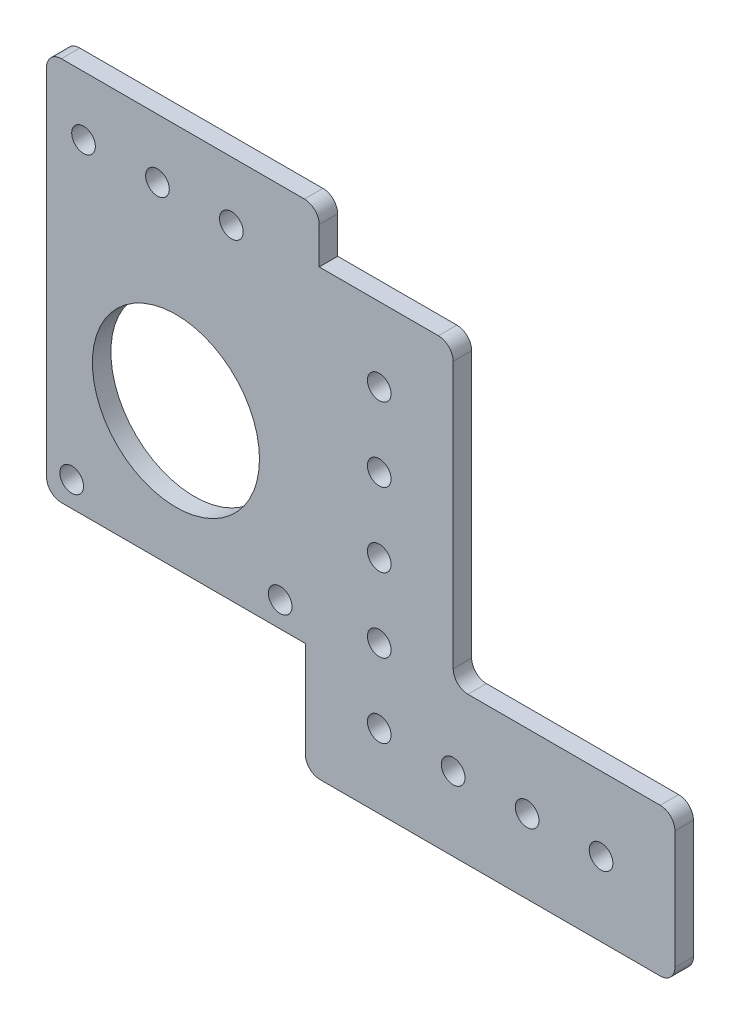
ISO-10303-21;
HEADER;
FILE_DESCRIPTION(('STEP AP214'),'2;1');
FILE_NAME('part.step','',(''),(''),'','','');
FILE_SCHEMA(('AUTOMOTIVE_DESIGN { 1 0 10303 214 1 1 1 1 }'));
ENDSEC;
DATA;
#1=APPLICATION_CONTEXT('core data for automotive mechanical design processes');
#2=APPLICATION_PROTOCOL_DEFINITION('international standard','automotive_design',2000,#1);
#3=PRODUCT_CONTEXT('',#1,'mechanical');
#4=PRODUCT('Part','Part','',(#3));
#5=PRODUCT_RELATED_PRODUCT_CATEGORY('part','',(#4));
#6=PRODUCT_DEFINITION_FORMATION('','',#4);
#7=PRODUCT_DEFINITION_CONTEXT('part definition',#1,'design');
#8=PRODUCT_DEFINITION('design','',#6,#7);
#9=PRODUCT_DEFINITION_SHAPE('','',#8);
#10=(LENGTH_UNIT() NAMED_UNIT(*) SI_UNIT(.MILLI.,.METRE.));
#11=(NAMED_UNIT(*) PLANE_ANGLE_UNIT() SI_UNIT($,.RADIAN.));
#12=(NAMED_UNIT(*) SI_UNIT($,.STERADIAN.) SOLID_ANGLE_UNIT());
#13=UNCERTAINTY_MEASURE_WITH_UNIT(LENGTH_MEASURE(1.E-05),#10,'distance_accuracy_value','');
#14=(GEOMETRIC_REPRESENTATION_CONTEXT(3) GLOBAL_UNCERTAINTY_ASSIGNED_CONTEXT((#13)) GLOBAL_UNIT_ASSIGNED_CONTEXT((#10,
#11,#12)) REPRESENTATION_CONTEXT('',''));
#15=CARTESIAN_POINT('',(0.,0.,0.));
#16=DIRECTION('',(0.,0.,1.));
#17=DIRECTION('',(1.,0.,0.));
#18=AXIS2_PLACEMENT_3D('',#15,#16,#17);
#19=CARTESIAN_POINT('',(12.7,0.,3.175));
#20=DIRECTION('',(-1.,0.,0.));
#21=DIRECTION('',(0.,-1.,0.));
#22=AXIS2_PLACEMENT_3D('',#19,#20,#21);
#23=PLANE('',#22);
#24=DIRECTION('',(0.,1.,0.));
#25=VECTOR('',#24,1.);
#26=CARTESIAN_POINT('',(12.7,0.,0.));
#27=LINE('',#26,#25);
#28=CARTESIAN_POINT('',(12.7,-10.16,0.));
#29=VERTEX_POINT('',#28);
#30=CARTESIAN_POINT('',(12.7,35.56,0.));
#31=VERTEX_POINT('',#30);
#32=EDGE_CURVE('E211',#29,#31,#27,.T.);
#33=ORIENTED_EDGE('',*,*,#32,.T.);
#34=DIRECTION('',(0.,0.,-1.));
#35=VECTOR('',#34,1.);
#36=CARTESIAN_POINT('',(12.7,35.56,3.175));
#37=LINE('',#36,#35);
#38=CARTESIAN_POINT('',(12.7,35.56,3.175));
#39=VERTEX_POINT('',#38);
#40=EDGE_CURVE('E262',#31,#39,#37,.F.);
#41=ORIENTED_EDGE('',*,*,#40,.T.);
#42=DIRECTION('',(0.,1.,0.));
#43=VECTOR('',#42,1.);
#44=CARTESIAN_POINT('',(12.7,0.,3.175));
#45=LINE('',#44,#43);
#46=CARTESIAN_POINT('',(12.7,-10.16,3.175));
#47=VERTEX_POINT('',#46);
#48=EDGE_CURVE('E184',#47,#39,#45,.T.);
#49=ORIENTED_EDGE('',*,*,#48,.F.);
#50=DIRECTION('',(0.,0.,1.));
#51=VECTOR('',#50,1.);
#52=CARTESIAN_POINT('',(12.7,-10.16,0.));
#53=LINE('',#52,#51);
#54=EDGE_CURVE('E260',#47,#29,#53,.F.);
#55=ORIENTED_EDGE('',*,*,#54,.T.);
#56=EDGE_LOOP('',(#33,#41,#49,#55));
#57=FACE_BOUND('',#56,.T.);
#58=ADVANCED_FACE('F34',(#57),#23,.F.);
#59=CARTESIAN_POINT('',(-57.15,0.,3.175));
#60=DIRECTION('',(-1.,0.,0.));
#61=DIRECTION('',(0.,0.,1.));
#62=AXIS2_PLACEMENT_3D('',#59,#60,#61);
#63=PLANE('',#62);
#64=DIRECTION('',(0.,1.,0.));
#65=VECTOR('',#64,1.);
#66=CARTESIAN_POINT('',(-57.15,0.,3.175));
#67=LINE('',#66,#65);
#68=CARTESIAN_POINT('',(-57.15,-16.568999882,3.175));
#69=VERTEX_POINT('',#68);
#70=CARTESIAN_POINT('',(-57.15,44.391000118,3.175));
#71=VERTEX_POINT('',#70);
#72=EDGE_CURVE('E224',#69,#71,#67,.T.);
#73=ORIENTED_EDGE('',*,*,#72,.T.);
#74=DIRECTION('',(0.,0.,-1.));
#75=VECTOR('',#74,1.);
#76=CARTESIAN_POINT('',(-57.15,44.391000118,3.175));
#77=LINE('',#76,#75);
#78=CARTESIAN_POINT('',(-57.15,44.391000118,0.));
#79=VERTEX_POINT('',#78);
#80=EDGE_CURVE('E11',#71,#79,#77,.T.);
#81=ORIENTED_EDGE('',*,*,#80,.T.);
#82=DIRECTION('',(0.,1.,0.));
#83=VECTOR('',#82,1.);
#84=CARTESIAN_POINT('',(-57.15,0.,0.));
#85=LINE('',#84,#83);
#86=CARTESIAN_POINT('',(-57.15,-16.568999882,0.));
#87=VERTEX_POINT('',#86);
#88=EDGE_CURVE('E199',#87,#79,#85,.T.);
#89=ORIENTED_EDGE('',*,*,#88,.F.);
#90=DIRECTION('',(0.,0.,-1.));
#91=VECTOR('',#90,1.);
#92=CARTESIAN_POINT('',(-57.15,-16.568999882,3.175));
#93=LINE('',#92,#91);
#94=EDGE_CURVE('E256',#87,#69,#93,.F.);
#95=ORIENTED_EDGE('',*,*,#94,.T.);
#96=EDGE_LOOP('',(#73,#81,#89,#95));
#97=FACE_BOUND('',#96,.T.);
#98=ADVANCED_FACE('F423',(#97),#63,.T.);
#99=CARTESIAN_POINT('',(0.,-19.108999882,3.175));
#100=DIRECTION('',(0.,1.,0.));
#101=DIRECTION('',(0.,0.,1.));
#102=AXIS2_PLACEMENT_3D('',#99,#100,#101);
#103=PLANE('',#102);
#104=DIRECTION('',(1.,0.,0.));
#105=VECTOR('',#104,1.);
#106=CARTESIAN_POINT('',(0.,-19.108999882,3.175));
#107=LINE('',#106,#105);
#108=CARTESIAN_POINT('',(-54.61,-19.108999882,3.175));
#109=VERTEX_POINT('',#108);
#110=CARTESIAN_POINT('',(-12.7,-19.108999882,3.175));
#111=VERTEX_POINT('',#110);
#112=EDGE_CURVE('E370',#109,#111,#107,.T.);
#113=ORIENTED_EDGE('',*,*,#112,.F.);
#114=DIRECTION('',(0.,0.,-1.));
#115=VECTOR('',#114,1.);
#116=CARTESIAN_POINT('',(-54.61,-19.108999882,0.));
#117=LINE('',#116,#115);
#118=CARTESIAN_POINT('',(-54.61,-19.108999882,0.));
#119=VERTEX_POINT('',#118);
#120=EDGE_CURVE('E253',#109,#119,#117,.T.);
#121=ORIENTED_EDGE('',*,*,#120,.T.);
#122=DIRECTION('',(1.,0.,0.));
#123=VECTOR('',#122,1.);
#124=CARTESIAN_POINT('',(0.,-19.108999882,0.));
#125=LINE('',#124,#123);
#126=CARTESIAN_POINT('',(-12.7,-19.108999882,0.));
#127=VERTEX_POINT('',#126);
#128=EDGE_CURVE('E202',#119,#127,#125,.T.);
#129=ORIENTED_EDGE('',*,*,#128,.T.);
#130=DIRECTION('',(0.,0.,-1.));
#131=VECTOR('',#130,1.);
#132=CARTESIAN_POINT('',(-12.7,-19.108999882,3.175));
#133=LINE('',#132,#131);
#134=EDGE_CURVE('E198',#111,#127,#133,.T.);
#135=ORIENTED_EDGE('',*,*,#134,.F.);
#136=EDGE_LOOP('',(#113,#121,#129,#135));
#137=FACE_BOUND('',#136,.T.);
#138=ADVANCED_FACE('F428',(#137),#103,.F.);
#139=CARTESIAN_POINT('',(-12.7,0.,3.175));
#140=DIRECTION('',(-1.,0.,0.));
#141=DIRECTION('',(0.,-1.,0.));
#142=AXIS2_PLACEMENT_3D('',#139,#140,#141);
#143=PLANE('',#142);
#144=DIRECTION('',(0.,1.,0.));
#145=VECTOR('',#144,1.);
#146=CARTESIAN_POINT('',(-12.7,0.,0.));
#147=LINE('',#146,#145);
#148=CARTESIAN_POINT('',(-12.7,-35.56,0.));
#149=VERTEX_POINT('',#148);
#150=EDGE_CURVE('E205',#149,#127,#147,.T.);
#151=ORIENTED_EDGE('',*,*,#150,.F.);
#152=DIRECTION('',(0.,0.,-1.));
#153=VECTOR('',#152,1.);
#154=CARTESIAN_POINT('',(-12.7,-35.56,3.175));
#155=LINE('',#154,#153);
#156=CARTESIAN_POINT('',(-12.7,-35.56,3.175));
#157=VERTEX_POINT('',#156);
#158=EDGE_CURVE('E242',#149,#157,#155,.F.);
#159=ORIENTED_EDGE('',*,*,#158,.T.);
#160=DIRECTION('',(0.,1.,0.));
#161=VECTOR('',#160,1.);
#162=CARTESIAN_POINT('',(-12.7,0.,3.175));
#163=LINE('',#162,#161);
#164=EDGE_CURVE('E372',#157,#111,#163,.T.);
#165=ORIENTED_EDGE('',*,*,#164,.T.);
#166=ORIENTED_EDGE('',*,*,#134,.T.);
#167=EDGE_LOOP('',(#151,#159,#165,#166));
#168=FACE_BOUND('',#167,.T.);
#169=ADVANCED_FACE('F437',(#168),#143,.T.);
#170=CARTESIAN_POINT('',(0.,-38.1,3.175));
#171=DIRECTION('',(0.,1.,0.));
#172=DIRECTION('',(0.,0.,1.));
#173=AXIS2_PLACEMENT_3D('',#170,#171,#172);
#174=PLANE('',#173);
#175=DIRECTION('',(1.,0.,0.));
#176=VECTOR('',#175,1.);
#177=CARTESIAN_POINT('',(0.,-38.1,3.175));
#178=LINE('',#177,#176);
#179=CARTESIAN_POINT('',(-10.16,-38.1,3.175));
#180=VERTEX_POINT('',#179);
#181=CARTESIAN_POINT('',(48.26,-38.1,3.175));
#182=VERTEX_POINT('',#181);
#183=EDGE_CURVE('E189',#180,#182,#178,.T.);
#184=ORIENTED_EDGE('',*,*,#183,.F.);
#185=DIRECTION('',(0.,0.,-1.));
#186=VECTOR('',#185,1.);
#187=CARTESIAN_POINT('',(-10.16,-38.1,0.));
#188=LINE('',#187,#186);
#189=CARTESIAN_POINT('',(-10.16,-38.1,0.));
#190=VERTEX_POINT('',#189);
#191=EDGE_CURVE('E229',#180,#190,#188,.T.);
#192=ORIENTED_EDGE('',*,*,#191,.T.);
#193=DIRECTION('',(1.,0.,0.));
#194=VECTOR('',#193,1.);
#195=CARTESIAN_POINT('',(0.,-38.1,0.));
#196=LINE('',#195,#194);
#197=CARTESIAN_POINT('',(48.26,-38.1,0.));
#198=VERTEX_POINT('',#197);
#199=EDGE_CURVE('E208',#190,#198,#196,.T.);
#200=ORIENTED_EDGE('',*,*,#199,.T.);
#201=DIRECTION('',(0.,0.,-1.));
#202=VECTOR('',#201,1.);
#203=CARTESIAN_POINT('',(48.26,-38.1,3.175));
#204=LINE('',#203,#202);
#205=EDGE_CURVE('E227',#198,#182,#204,.F.);
#206=ORIENTED_EDGE('',*,*,#205,.T.);
#207=EDGE_LOOP('',(#184,#192,#200,#206));
#208=FACE_BOUND('',#207,.T.);
#209=ADVANCED_FACE('F434',(#208),#174,.F.);
#210=CARTESIAN_POINT('',(0.,38.1,3.175));
#211=DIRECTION('',(0.,1.,0.));
#212=DIRECTION('',(0.,0.,1.));
#213=AXIS2_PLACEMENT_3D('',#210,#211,#212);
#214=PLANE('',#213);
#215=DIRECTION('',(0.,0.,-1.));
#216=VECTOR('',#215,1.);
#217=CARTESIAN_POINT('',(-10.3111442919186,38.1,3.175));
#218=LINE('',#217,#216);
#219=CARTESIAN_POINT('',(-10.3111442919186,38.1,3.175));
#220=VERTEX_POINT('',#219);
#221=CARTESIAN_POINT('',(-10.3111442919186,38.1,0.));
#222=VERTEX_POINT('',#221);
#223=EDGE_CURVE('E163',#220,#222,#218,.T.);
#224=ORIENTED_EDGE('',*,*,#223,.F.);
#225=DIRECTION('',(1.,0.,0.));
#226=VECTOR('',#225,1.);
#227=CARTESIAN_POINT('',(0.,38.1,3.175));
#228=LINE('',#227,#226);
#229=CARTESIAN_POINT('',(10.16,38.1,3.175));
#230=VERTEX_POINT('',#229);
#231=EDGE_CURVE('E172',#220,#230,#228,.T.);
#232=ORIENTED_EDGE('',*,*,#231,.T.);
#233=DIRECTION('',(0.,0.,-1.));
#234=VECTOR('',#233,1.);
#235=CARTESIAN_POINT('',(10.16,38.1,0.));
#236=LINE('',#235,#234);
#237=CARTESIAN_POINT('',(10.16,38.1,0.));
#238=VERTEX_POINT('',#237);
#239=EDGE_CURVE('E258',#230,#238,#236,.T.);
#240=ORIENTED_EDGE('',*,*,#239,.T.);
#241=DIRECTION('',(1.,0.,0.));
#242=VECTOR('',#241,1.);
#243=CARTESIAN_POINT('',(0.,38.1,0.));
#244=LINE('',#243,#242);
#245=EDGE_CURVE('E174',#222,#238,#244,.T.);
#246=ORIENTED_EDGE('',*,*,#245,.F.);
#247=EDGE_LOOP('',(#224,#232,#240,#246));
#248=FACE_BOUND('',#247,.T.);
#249=ADVANCED_FACE('F170',(#248),#214,.T.);
#250=CARTESIAN_POINT('',(-17.018,-14.790999882,3.175));
#251=DIRECTION('',(0.,0.,-1.));
#252=DIRECTION('',(-1.,0.,0.));
#253=AXIS2_PLACEMENT_3D('',#250,#251,#252);
#254=CYLINDRICAL_SURFACE('',#253,2.03200000000001);
#255=CARTESIAN_POINT('',(-17.018,-14.790999882,3.175));
#256=DIRECTION('',(0.,0.,1.));
#257=DIRECTION('',(1.,0.,0.));
#258=AXIS2_PLACEMENT_3D('',#255,#256,#257);
#259=CIRCLE('',#258,2.03200000000001);
#260=CARTESIAN_POINT('',(-14.986,-14.790999882,3.175));
#261=VERTEX_POINT('',#260);
#262=EDGE_CURVE('E187',#261,#261,#259,.T.);
#263=ORIENTED_EDGE('',*,*,#262,.T.);
#264=EDGE_LOOP('',(#263));
#265=FACE_BOUND('',#264,.T.);
#266=CARTESIAN_POINT('',(-17.018,-14.790999882,0.));
#267=DIRECTION('',(0.,0.,1.));
#268=DIRECTION('',(1.,0.,0.));
#269=AXIS2_PLACEMENT_3D('',#266,#267,#268);
#270=CIRCLE('',#269,2.03200000000001);
#271=CARTESIAN_POINT('',(-14.986,-14.790999882,0.));
#272=VERTEX_POINT('',#271);
#273=EDGE_CURVE('E218',#272,#272,#270,.T.);
#274=ORIENTED_EDGE('',*,*,#273,.F.);
#275=EDGE_LOOP('',(#274));
#276=FACE_BOUND('',#275,.T.);
#277=ADVANCED_FACE('F655',(#265,#276),#254,.F.);
#278=CARTESIAN_POINT('',(-34.925,4.386000118,3.175));
#279=DIRECTION('',(0.,0.,-1.));
#280=DIRECTION('',(-1.,0.,0.));
#281=AXIS2_PLACEMENT_3D('',#278,#279,#280);
#282=CYLINDRICAL_SURFACE('',#281,14.351);
#283=CARTESIAN_POINT('',(-34.925,4.386000118,3.175));
#284=DIRECTION('',(0.,0.,1.));
#285=DIRECTION('',(1.,0.,0.));
#286=AXIS2_PLACEMENT_3D('',#283,#284,#285);
#287=CIRCLE('',#286,14.351);
#288=CARTESIAN_POINT('',(-20.574,4.386000118,3.175));
#289=VERTEX_POINT('',#288);
#290=EDGE_CURVE('E183',#289,#289,#287,.T.);
#291=ORIENTED_EDGE('',*,*,#290,.T.);
#292=EDGE_LOOP('',(#291));
#293=FACE_BOUND('',#292,.T.);
#294=CARTESIAN_POINT('',(-34.925,4.386000118,0.));
#295=DIRECTION('',(0.,0.,1.));
#296=DIRECTION('',(1.,0.,0.));
#297=AXIS2_PLACEMENT_3D('',#294,#295,#296);
#298=CIRCLE('',#297,14.351);
#299=CARTESIAN_POINT('',(-20.574,4.386000118,0.));
#300=VERTEX_POINT('',#299);
#301=EDGE_CURVE('E215',#300,#300,#298,.T.);
#302=ORIENTED_EDGE('',*,*,#301,.F.);
#303=EDGE_LOOP('',(#302));
#304=FACE_BOUND('',#303,.T.);
#305=ADVANCED_FACE('F661',(#293,#304),#282,.F.);
#306=CARTESIAN_POINT('',(-52.832,-14.790999882,3.175));
#307=DIRECTION('',(0.,0.,-1.));
#308=DIRECTION('',(-1.,0.,0.));
#309=AXIS2_PLACEMENT_3D('',#306,#307,#308);
#310=CYLINDRICAL_SURFACE('',#309,2.03200000000001);
#311=CARTESIAN_POINT('',(-52.832,-14.790999882,3.175));
#312=DIRECTION('',(0.,0.,1.));
#313=DIRECTION('',(1.,0.,0.));
#314=AXIS2_PLACEMENT_3D('',#311,#312,#313);
#315=CIRCLE('',#314,2.03200000000001);
#316=CARTESIAN_POINT('',(-50.8,-14.790999882,3.175));
#317=VERTEX_POINT('',#316);
#318=EDGE_CURVE('E195',#317,#317,#315,.F.);
#319=ORIENTED_EDGE('',*,*,#318,.F.);
#320=EDGE_LOOP('',(#319));
#321=FACE_BOUND('',#320,.T.);
#322=CARTESIAN_POINT('',(-52.832,-14.790999882,0.));
#323=DIRECTION('',(0.,0.,1.));
#324=DIRECTION('',(1.,0.,0.));
#325=AXIS2_PLACEMENT_3D('',#322,#323,#324);
#326=CIRCLE('',#325,2.03200000000001);
#327=CARTESIAN_POINT('',(-50.8,-14.790999882,0.));
#328=VERTEX_POINT('',#327);
#329=EDGE_CURVE('E221',#328,#328,#326,.F.);
#330=ORIENTED_EDGE('',*,*,#329,.T.);
#331=EDGE_LOOP('',(#330));
#332=FACE_BOUND('',#331,.T.);
#333=ADVANCED_FACE('F534',(#321,#332),#310,.F.);
#334=CARTESIAN_POINT('',(0.,0.,3.175));
#335=DIRECTION('',(0.,0.,1.));
#336=DIRECTION('',(1.,0.,0.));
#337=AXIS2_PLACEMENT_3D('',#334,#335,#336);
#338=PLANE('',#337);
#339=CARTESIAN_POINT('',(-25.4,36.771000118,3.175));
#340=DIRECTION('',(0.,0.,-1.));
#341=DIRECTION('',(-1.,0.,0.));
#342=AXIS2_PLACEMENT_3D('',#339,#340,#341);
#343=CIRCLE('',#342,2.032);
#344=CARTESIAN_POINT('',(-27.432,36.771000118,3.175));
#345=VERTEX_POINT('',#344);
#346=EDGE_CURVE('E305',#345,#345,#343,.T.);
#347=ORIENTED_EDGE('',*,*,#346,.T.);
#348=EDGE_LOOP('',(#347));
#349=FACE_BOUND('',#348,.T.);
#350=CARTESIAN_POINT('',(-38.1,36.771000118,3.175));
#351=DIRECTION('',(0.,0.,-1.));
#352=DIRECTION('',(-1.,0.,0.));
#353=AXIS2_PLACEMENT_3D('',#350,#351,#352);
#354=CIRCLE('',#353,2.032);
#355=CARTESIAN_POINT('',(-40.132,36.771000118,3.175));
#356=VERTEX_POINT('',#355);
#357=EDGE_CURVE('E824',#356,#356,#354,.T.);
#358=ORIENTED_EDGE('',*,*,#357,.T.);
#359=EDGE_LOOP('',(#358));
#360=FACE_BOUND('',#359,.T.);
#361=CARTESIAN_POINT('',(-50.8,36.771000118,3.175));
#362=DIRECTION('',(0.,0.,-1.));
#363=DIRECTION('',(-1.,0.,0.));
#364=AXIS2_PLACEMENT_3D('',#361,#362,#363);
#365=CIRCLE('',#364,2.032);
#366=CARTESIAN_POINT('',(-52.832,36.771000118,3.175));
#367=VERTEX_POINT('',#366);
#368=EDGE_CURVE('E820',#367,#367,#365,.T.);
#369=ORIENTED_EDGE('',*,*,#368,.T.);
#370=EDGE_LOOP('',(#369));
#371=FACE_BOUND('',#370,.T.);
#372=DIRECTION('',(0.,-1.,0.));
#373=VECTOR('',#372,1.);
#374=CARTESIAN_POINT('',(-10.3111442919186,46.931000118,3.175));
#375=LINE('',#374,#373);
#376=CARTESIAN_POINT('',(-10.3111442919186,44.391000118,3.175));
#377=VERTEX_POINT('',#376);
#378=EDGE_CURVE('E160',#377,#220,#375,.T.);
#379=ORIENTED_EDGE('',*,*,#378,.F.);
#380=CARTESIAN_POINT('',(-12.8511442919186,44.391000118,3.175));
#381=DIRECTION('',(0.,0.,1.));
#382=DIRECTION('',(1.,0.,0.));
#383=AXIS2_PLACEMENT_3D('',#380,#381,#382);
#384=CIRCLE('',#383,2.54);
#385=CARTESIAN_POINT('',(-12.8511442919186,46.931000118,3.175));
#386=VERTEX_POINT('',#385);
#387=EDGE_CURVE('E42',#377,#386,#384,.T.);
#388=ORIENTED_EDGE('',*,*,#387,.T.);
#389=DIRECTION('',(1.,0.,0.));
#390=VECTOR('',#389,1.);
#391=CARTESIAN_POINT('',(-10.3111442919186,46.931000118,3.175));
#392=LINE('',#391,#390);
#393=CARTESIAN_POINT('',(-54.61,46.931000118,3.175));
#394=VERTEX_POINT('',#393);
#395=EDGE_CURVE('E167',#394,#386,#392,.T.);
#396=ORIENTED_EDGE('',*,*,#395,.F.);
#397=CARTESIAN_POINT('',(-54.61,44.391000118,3.175));
#398=DIRECTION('',(0.,0.,1.));
#399=DIRECTION('',(1.,0.,0.));
#400=AXIS2_PLACEMENT_3D('',#397,#398,#399);
#401=CIRCLE('',#400,2.54);
#402=EDGE_CURVE('E49',#394,#71,#401,.T.);
#403=ORIENTED_EDGE('',*,*,#402,.T.);
#404=ORIENTED_EDGE('',*,*,#72,.F.);
#405=CARTESIAN_POINT('',(-54.61,-16.568999882,3.175));
#406=DIRECTION('',(0.,0.,1.));
#407=DIRECTION('',(1.,0.,0.));
#408=AXIS2_PLACEMENT_3D('',#405,#406,#407);
#409=CIRCLE('',#408,2.54);
#410=EDGE_CURVE('E249',#69,#109,#409,.T.);
#411=ORIENTED_EDGE('',*,*,#410,.T.);
#412=ORIENTED_EDGE('',*,*,#112,.T.);
#413=ORIENTED_EDGE('',*,*,#164,.F.);
#414=CARTESIAN_POINT('',(-10.16,-35.56,3.175));
#415=DIRECTION('',(0.,0.,1.));
#416=DIRECTION('',(1.,0.,0.));
#417=AXIS2_PLACEMENT_3D('',#414,#415,#416);
#418=CIRCLE('',#417,2.54);
#419=EDGE_CURVE('E251',#157,#180,#418,.T.);
#420=ORIENTED_EDGE('',*,*,#419,.T.);
#421=ORIENTED_EDGE('',*,*,#183,.T.);
#422=CARTESIAN_POINT('',(48.26,-35.56,3.175));
#423=DIRECTION('',(0.,0.,1.));
#424=DIRECTION('',(1.,0.,0.));
#425=AXIS2_PLACEMENT_3D('',#422,#423,#424);
#426=CIRCLE('',#425,2.54);
#427=CARTESIAN_POINT('',(50.8,-35.56,3.175));
#428=VERTEX_POINT('',#427);
#429=EDGE_CURVE('E244',#182,#428,#426,.T.);
#430=ORIENTED_EDGE('',*,*,#429,.T.);
#431=DIRECTION('',(0.,-1.,0.));
#432=VECTOR('',#431,1.);
#433=CARTESIAN_POINT('',(50.8,-38.1,3.175));
#434=LINE('',#433,#432);
#435=CARTESIAN_POINT('',(50.8,-15.24,3.175));
#436=VERTEX_POINT('',#435);
#437=EDGE_CURVE('E314',#436,#428,#434,.T.);
#438=ORIENTED_EDGE('',*,*,#437,.F.);
#439=CARTESIAN_POINT('',(48.26,-15.24,3.175));
#440=DIRECTION('',(0.,0.,1.));
#441=DIRECTION('',(1.,0.,0.));
#442=AXIS2_PLACEMENT_3D('',#439,#440,#441);
#443=CIRCLE('',#442,2.54);
#444=CARTESIAN_POINT('',(48.26,-12.7,3.175));
#445=VERTEX_POINT('',#444);
#446=EDGE_CURVE('E246',#436,#445,#443,.T.);
#447=ORIENTED_EDGE('',*,*,#446,.T.);
#448=DIRECTION('',(-1.,0.,0.));
#449=VECTOR('',#448,1.);
#450=CARTESIAN_POINT('',(50.8,-12.7,3.175));
#451=LINE('',#450,#449);
#452=CARTESIAN_POINT('',(15.24,-12.7,3.175));
#453=VERTEX_POINT('',#452);
#454=EDGE_CURVE('E334',#445,#453,#451,.T.);
#455=ORIENTED_EDGE('',*,*,#454,.T.);
#456=CARTESIAN_POINT('',(15.24,-10.16,3.175));
#457=DIRECTION('',(0.,0.,1.));
#458=DIRECTION('',(1.,0.,0.));
#459=AXIS2_PLACEMENT_3D('',#456,#457,#458);
#460=CIRCLE('',#459,2.54);
#461=EDGE_CURVE('E275',#453,#47,#460,.F.);
#462=ORIENTED_EDGE('',*,*,#461,.T.);
#463=ORIENTED_EDGE('',*,*,#48,.T.);
#464=CARTESIAN_POINT('',(10.16,35.56,3.175));
#465=DIRECTION('',(0.,0.,1.));
#466=DIRECTION('',(1.,0.,0.));
#467=AXIS2_PLACEMENT_3D('',#464,#465,#466);
#468=CIRCLE('',#467,2.54);
#469=EDGE_CURVE('E181',#39,#230,#468,.T.);
#470=ORIENTED_EDGE('',*,*,#469,.T.);
#471=ORIENTED_EDGE('',*,*,#231,.F.);
#472=EDGE_LOOP('',(#379,#388,#396,#403,#404,#411,#412,#413,#420,#421,#430,#438,#447,#455,#462,
#463,#470,#471));
#473=FACE_BOUND('',#472,.T.);
#474=CARTESIAN_POINT('',(12.7,-25.4000000000006,3.175));
#475=DIRECTION('',(0.,0.,-1.));
#476=DIRECTION('',(-1.,0.,0.));
#477=AXIS2_PLACEMENT_3D('',#474,#475,#476);
#478=CIRCLE('',#477,2.032);
#479=CARTESIAN_POINT('',(10.668,-25.4000000000006,3.175));
#480=VERTEX_POINT('',#479);
#481=EDGE_CURVE('E311',#480,#480,#478,.T.);
#482=ORIENTED_EDGE('',*,*,#481,.T.);
#483=EDGE_LOOP('',(#482));
#484=FACE_BOUND('',#483,.T.);
#485=CARTESIAN_POINT('',(25.4,-25.4000000000007,3.175));
#486=DIRECTION('',(0.,0.,-1.));
#487=DIRECTION('',(-1.,0.,0.));
#488=AXIS2_PLACEMENT_3D('',#485,#486,#487);
#489=CIRCLE('',#488,2.032);
#490=CARTESIAN_POINT('',(23.368,-25.4000000000007,3.175));
#491=VERTEX_POINT('',#490);
#492=EDGE_CURVE('E318',#491,#491,#489,.T.);
#493=ORIENTED_EDGE('',*,*,#492,.T.);
#494=EDGE_LOOP('',(#493));
#495=FACE_BOUND('',#494,.T.);
#496=CARTESIAN_POINT('',(38.1,-25.4000000000008,3.175));
#497=DIRECTION('',(0.,0.,-1.));
#498=DIRECTION('',(-1.,0.,0.));
#499=AXIS2_PLACEMENT_3D('',#496,#497,#498);
#500=CIRCLE('',#499,2.032);
#501=CARTESIAN_POINT('',(36.068,-25.4000000000008,3.175));
#502=VERTEX_POINT('',#501);
#503=EDGE_CURVE('E324',#502,#502,#500,.T.);
#504=ORIENTED_EDGE('',*,*,#503,.T.);
#505=EDGE_LOOP('',(#504));
#506=FACE_BOUND('',#505,.T.);
#507=CARTESIAN_POINT('',(0.,12.6999999999995,3.175));
#508=DIRECTION('',(0.,0.,1.));
#509=DIRECTION('',(1.,0.,0.));
#510=AXIS2_PLACEMENT_3D('',#507,#508,#509);
#511=CIRCLE('',#510,2.032);
#512=CARTESIAN_POINT('',(2.032,12.6999999999995,3.175));
#513=VERTEX_POINT('',#512);
#514=EDGE_CURVE('E345',#513,#513,#511,.T.);
#515=ORIENTED_EDGE('',*,*,#514,.F.);
#516=EDGE_LOOP('',(#515));
#517=FACE_BOUND('',#516,.T.);
#518=CARTESIAN_POINT('',(0.,25.3999999999995,3.175));
#519=DIRECTION('',(0.,0.,1.));
#520=DIRECTION('',(1.,0.,0.));
#521=AXIS2_PLACEMENT_3D('',#518,#519,#520);
#522=CIRCLE('',#521,2.032);
#523=CARTESIAN_POINT('',(2.032,25.3999999999995,3.175));
#524=VERTEX_POINT('',#523);
#525=EDGE_CURVE('E351',#524,#524,#522,.T.);
#526=ORIENTED_EDGE('',*,*,#525,.F.);
#527=EDGE_LOOP('',(#526));
#528=FACE_BOUND('',#527,.T.);
#529=CARTESIAN_POINT('',(0.,-12.7000000000005,3.175));
#530=DIRECTION('',(0.,0.,1.));
#531=DIRECTION('',(1.,0.,0.));
#532=AXIS2_PLACEMENT_3D('',#529,#530,#531);
#533=CIRCLE('',#532,2.032);
#534=CARTESIAN_POINT('',(2.032,-12.7000000000005,3.175));
#535=VERTEX_POINT('',#534);
#536=EDGE_CURVE('E357',#535,#535,#533,.T.);
#537=ORIENTED_EDGE('',*,*,#536,.F.);
#538=EDGE_LOOP('',(#537));
#539=FACE_BOUND('',#538,.T.);
#540=CARTESIAN_POINT('',(0.,-25.4000000000005,3.175));
#541=DIRECTION('',(0.,0.,1.));
#542=DIRECTION('',(1.,0.,0.));
#543=AXIS2_PLACEMENT_3D('',#540,#541,#542);
#544=CIRCLE('',#543,2.032);
#545=CARTESIAN_POINT('',(2.032,-25.4000000000005,3.175));
#546=VERTEX_POINT('',#545);
#547=EDGE_CURVE('E340',#546,#546,#544,.T.);
#548=ORIENTED_EDGE('',*,*,#547,.F.);
#549=EDGE_LOOP('',(#548));
#550=FACE_BOUND('',#549,.T.);
#551=CARTESIAN_POINT('',(0.,-5.13478148889135E-13,3.175));
#552=DIRECTION('',(0.,0.,1.));
#553=DIRECTION('',(1.,0.,0.));
#554=AXIS2_PLACEMENT_3D('',#551,#552,#553);
#555=CIRCLE('',#554,2.032);
#556=CARTESIAN_POINT('',(2.032,-5.13478148889135E-13,3.175));
#557=VERTEX_POINT('',#556);
#558=EDGE_CURVE('E344',#557,#557,#555,.T.);
#559=ORIENTED_EDGE('',*,*,#558,.F.);
#560=EDGE_LOOP('',(#559));
#561=FACE_BOUND('',#560,.T.);
#562=ORIENTED_EDGE('',*,*,#290,.F.);
#563=EDGE_LOOP('',(#562));
#564=FACE_BOUND('',#563,.T.);
#565=ORIENTED_EDGE('',*,*,#262,.F.);
#566=EDGE_LOOP('',(#565));
#567=FACE_BOUND('',#566,.T.);
#568=ORIENTED_EDGE('',*,*,#318,.T.);
#569=EDGE_LOOP('',(#568));
#570=FACE_BOUND('',#569,.T.);
#571=ADVANCED_FACE('F177',(#349,#360,#371,#473,#484,#495,#506,#517,#528,#539,#550,#561,#564,
#567,#570),#338,.T.);
#572=CARTESIAN_POINT('',(0.,0.,0.));
#573=DIRECTION('',(0.,0.,1.));
#574=DIRECTION('',(1.,0.,0.));
#575=AXIS2_PLACEMENT_3D('',#572,#573,#574);
#576=PLANE('',#575);
#577=CARTESIAN_POINT('',(-25.4,36.771000118,0.));
#578=DIRECTION('',(0.,0.,-1.));
#579=DIRECTION('',(-1.,0.,0.));
#580=AXIS2_PLACEMENT_3D('',#577,#578,#579);
#581=CIRCLE('',#580,2.032);
#582=CARTESIAN_POINT('',(-27.432,36.771000118,0.));
#583=VERTEX_POINT('',#582);
#584=EDGE_CURVE('E812',#583,#583,#581,.T.);
#585=ORIENTED_EDGE('',*,*,#584,.F.);
#586=EDGE_LOOP('',(#585));
#587=FACE_BOUND('',#586,.T.);
#588=CARTESIAN_POINT('',(-38.1,36.771000118,0.));
#589=DIRECTION('',(0.,0.,-1.));
#590=DIRECTION('',(-1.,0.,0.));
#591=AXIS2_PLACEMENT_3D('',#588,#589,#590);
#592=CIRCLE('',#591,2.032);
#593=CARTESIAN_POINT('',(-40.132,36.771000118,0.));
#594=VERTEX_POINT('',#593);
#595=EDGE_CURVE('E816',#594,#594,#592,.T.);
#596=ORIENTED_EDGE('',*,*,#595,.F.);
#597=EDGE_LOOP('',(#596));
#598=FACE_BOUND('',#597,.T.);
#599=CARTESIAN_POINT('',(-50.8,36.771000118,0.));
#600=DIRECTION('',(0.,0.,-1.));
#601=DIRECTION('',(-1.,0.,0.));
#602=AXIS2_PLACEMENT_3D('',#599,#600,#601);
#603=CIRCLE('',#602,2.032);
#604=CARTESIAN_POINT('',(-52.832,36.771000118,0.));
#605=VERTEX_POINT('',#604);
#606=EDGE_CURVE('E308',#605,#605,#603,.T.);
#607=ORIENTED_EDGE('',*,*,#606,.F.);
#608=EDGE_LOOP('',(#607));
#609=FACE_BOUND('',#608,.T.);
#610=DIRECTION('',(1.,0.,0.));
#611=VECTOR('',#610,1.);
#612=CARTESIAN_POINT('',(-10.3111442919186,46.931000118,0.));
#613=LINE('',#612,#611);
#614=CARTESIAN_POINT('',(-54.61,46.931000118,0.));
#615=VERTEX_POINT('',#614);
#616=CARTESIAN_POINT('',(-12.8511442919186,46.931000118,0.));
#617=VERTEX_POINT('',#616);
#618=EDGE_CURVE('E303',#615,#617,#613,.T.);
#619=ORIENTED_EDGE('',*,*,#618,.T.);
#620=CARTESIAN_POINT('',(-12.8511442919186,44.391000118,0.));
#621=DIRECTION('',(0.,0.,1.));
#622=DIRECTION('',(1.,0.,0.));
#623=AXIS2_PLACEMENT_3D('',#620,#621,#622);
#624=CIRCLE('',#623,2.54);
#625=CARTESIAN_POINT('',(-10.3111442919186,44.391000118,0.));
#626=VERTEX_POINT('',#625);
#627=EDGE_CURVE('E286',#617,#626,#624,.F.);
#628=ORIENTED_EDGE('',*,*,#627,.T.);
#629=DIRECTION('',(0.,-1.,0.));
#630=VECTOR('',#629,1.);
#631=CARTESIAN_POINT('',(-10.3111442919186,46.931000118,0.));
#632=LINE('',#631,#630);
#633=EDGE_CURVE('E297',#626,#222,#632,.T.);
#634=ORIENTED_EDGE('',*,*,#633,.T.);
#635=ORIENTED_EDGE('',*,*,#245,.T.);
#636=CARTESIAN_POINT('',(10.16,35.56,0.));
#637=DIRECTION('',(0.,0.,1.));
#638=DIRECTION('',(1.,0.,0.));
#639=AXIS2_PLACEMENT_3D('',#636,#637,#638);
#640=CIRCLE('',#639,2.54);
#641=EDGE_CURVE('E236',#238,#31,#640,.F.);
#642=ORIENTED_EDGE('',*,*,#641,.T.);
#643=ORIENTED_EDGE('',*,*,#32,.F.);
#644=CARTESIAN_POINT('',(15.24,-10.16,0.));
#645=DIRECTION('',(0.,0.,1.));
#646=DIRECTION('',(1.,0.,0.));
#647=AXIS2_PLACEMENT_3D('',#644,#645,#646);
#648=CIRCLE('',#647,2.54);
#649=CARTESIAN_POINT('',(15.24,-12.7,0.));
#650=VERTEX_POINT('',#649);
#651=EDGE_CURVE('E277',#29,#650,#648,.T.);
#652=ORIENTED_EDGE('',*,*,#651,.T.);
#653=DIRECTION('',(-1.,0.,0.));
#654=VECTOR('',#653,1.);
#655=CARTESIAN_POINT('',(50.8,-12.7,0.));
#656=LINE('',#655,#654);
#657=CARTESIAN_POINT('',(48.26,-12.7,0.));
#658=VERTEX_POINT('',#657);
#659=EDGE_CURVE('E337',#658,#650,#656,.T.);
#660=ORIENTED_EDGE('',*,*,#659,.F.);
#661=CARTESIAN_POINT('',(48.26,-15.24,0.));
#662=DIRECTION('',(0.,0.,1.));
#663=DIRECTION('',(1.,0.,0.));
#664=AXIS2_PLACEMENT_3D('',#661,#662,#663);
#665=CIRCLE('',#664,2.54);
#666=CARTESIAN_POINT('',(50.8,-15.24,0.));
#667=VERTEX_POINT('',#666);
#668=EDGE_CURVE('E234',#658,#667,#665,.F.);
#669=ORIENTED_EDGE('',*,*,#668,.T.);
#670=DIRECTION('',(0.,1.,0.));
#671=VECTOR('',#670,1.);
#672=CARTESIAN_POINT('',(50.8,-38.1,0.));
#673=LINE('',#672,#671);
#674=CARTESIAN_POINT('',(50.8,-35.56,0.));
#675=VERTEX_POINT('',#674);
#676=EDGE_CURVE('E331',#675,#667,#673,.T.);
#677=ORIENTED_EDGE('',*,*,#676,.F.);
#678=CARTESIAN_POINT('',(48.26,-35.56,0.));
#679=DIRECTION('',(0.,0.,1.));
#680=DIRECTION('',(1.,0.,0.));
#681=AXIS2_PLACEMENT_3D('',#678,#679,#680);
#682=CIRCLE('',#681,2.54);
#683=EDGE_CURVE('E232',#675,#198,#682,.F.);
#684=ORIENTED_EDGE('',*,*,#683,.T.);
#685=ORIENTED_EDGE('',*,*,#199,.F.);
#686=CARTESIAN_POINT('',(-10.16,-35.56,0.));
#687=DIRECTION('',(0.,0.,1.));
#688=DIRECTION('',(1.,0.,0.));
#689=AXIS2_PLACEMENT_3D('',#686,#687,#688);
#690=CIRCLE('',#689,2.54);
#691=EDGE_CURVE('E240',#190,#149,#690,.F.);
#692=ORIENTED_EDGE('',*,*,#691,.T.);
#693=ORIENTED_EDGE('',*,*,#150,.T.);
#694=ORIENTED_EDGE('',*,*,#128,.F.);
#695=CARTESIAN_POINT('',(-54.61,-16.568999882,0.));
#696=DIRECTION('',(0.,0.,1.));
#697=DIRECTION('',(1.,0.,0.));
#698=AXIS2_PLACEMENT_3D('',#695,#696,#697);
#699=CIRCLE('',#698,2.54);
#700=EDGE_CURVE('E238',#119,#87,#699,.F.);
#701=ORIENTED_EDGE('',*,*,#700,.T.);
#702=ORIENTED_EDGE('',*,*,#88,.T.);
#703=CARTESIAN_POINT('',(-54.61,44.391000118,0.));
#704=DIRECTION('',(0.,0.,1.));
#705=DIRECTION('',(1.,0.,0.));
#706=AXIS2_PLACEMENT_3D('',#703,#704,#705);
#707=CIRCLE('',#706,2.54);
#708=EDGE_CURVE('E284',#79,#615,#707,.F.);
#709=ORIENTED_EDGE('',*,*,#708,.T.);
#710=EDGE_LOOP('',(#619,#628,#634,#635,#642,#643,#652,#660,#669,#677,#684,#685,#692,#693,#694,
#701,#702,#709));
#711=FACE_BOUND('',#710,.T.);
#712=CARTESIAN_POINT('',(12.7,-25.4000000000006,0.));
#713=DIRECTION('',(0.,0.,-1.));
#714=DIRECTION('',(-1.,0.,0.));
#715=AXIS2_PLACEMENT_3D('',#712,#713,#714);
#716=CIRCLE('',#715,2.032);
#717=CARTESIAN_POINT('',(10.668,-25.4000000000006,0.));
#718=VERTEX_POINT('',#717);
#719=EDGE_CURVE('E315',#718,#718,#716,.T.);
#720=ORIENTED_EDGE('',*,*,#719,.F.);
#721=EDGE_LOOP('',(#720));
#722=FACE_BOUND('',#721,.T.);
#723=CARTESIAN_POINT('',(25.4,-25.4000000000007,0.));
#724=DIRECTION('',(0.,0.,-1.));
#725=DIRECTION('',(-1.,0.,0.));
#726=AXIS2_PLACEMENT_3D('',#723,#724,#725);
#727=CIRCLE('',#726,2.032);
#728=CARTESIAN_POINT('',(23.368,-25.4000000000007,0.));
#729=VERTEX_POINT('',#728);
#730=EDGE_CURVE('E321',#729,#729,#727,.T.);
#731=ORIENTED_EDGE('',*,*,#730,.F.);
#732=EDGE_LOOP('',(#731));
#733=FACE_BOUND('',#732,.T.);
#734=CARTESIAN_POINT('',(38.1,-25.4000000000008,0.));
#735=DIRECTION('',(0.,0.,-1.));
#736=DIRECTION('',(-1.,0.,0.));
#737=AXIS2_PLACEMENT_3D('',#734,#735,#736);
#738=CIRCLE('',#737,2.032);
#739=CARTESIAN_POINT('',(36.068,-25.4000000000008,0.));
#740=VERTEX_POINT('',#739);
#741=EDGE_CURVE('E175',#740,#740,#738,.T.);
#742=ORIENTED_EDGE('',*,*,#741,.F.);
#743=EDGE_LOOP('',(#742));
#744=FACE_BOUND('',#743,.T.);
#745=CARTESIAN_POINT('',(0.,12.6999999999995,0.));
#746=DIRECTION('',(0.,0.,1.));
#747=DIRECTION('',(1.,0.,0.));
#748=AXIS2_PLACEMENT_3D('',#745,#746,#747);
#749=CIRCLE('',#748,2.032);
#750=CARTESIAN_POINT('',(2.032,12.6999999999995,0.));
#751=VERTEX_POINT('',#750);
#752=EDGE_CURVE('E341',#751,#751,#749,.T.);
#753=ORIENTED_EDGE('',*,*,#752,.T.);
#754=EDGE_LOOP('',(#753));
#755=FACE_BOUND('',#754,.T.);
#756=CARTESIAN_POINT('',(0.,25.3999999999995,0.));
#757=DIRECTION('',(0.,0.,1.));
#758=DIRECTION('',(1.,0.,0.));
#759=AXIS2_PLACEMENT_3D('',#756,#757,#758);
#760=CIRCLE('',#759,2.032);
#761=CARTESIAN_POINT('',(2.032,25.3999999999995,0.));
#762=VERTEX_POINT('',#761);
#763=EDGE_CURVE('E348',#762,#762,#760,.T.);
#764=ORIENTED_EDGE('',*,*,#763,.T.);
#765=EDGE_LOOP('',(#764));
#766=FACE_BOUND('',#765,.T.);
#767=CARTESIAN_POINT('',(0.,-12.7000000000005,0.));
#768=DIRECTION('',(0.,0.,1.));
#769=DIRECTION('',(1.,0.,0.));
#770=AXIS2_PLACEMENT_3D('',#767,#768,#769);
#771=CIRCLE('',#770,2.032);
#772=CARTESIAN_POINT('',(2.032,-12.7000000000005,0.));
#773=VERTEX_POINT('',#772);
#774=EDGE_CURVE('E354',#773,#773,#771,.T.);
#775=ORIENTED_EDGE('',*,*,#774,.T.);
#776=EDGE_LOOP('',(#775));
#777=FACE_BOUND('',#776,.T.);
#778=CARTESIAN_POINT('',(0.,-25.4000000000005,0.));
#779=DIRECTION('',(0.,0.,1.));
#780=DIRECTION('',(1.,0.,0.));
#781=AXIS2_PLACEMENT_3D('',#778,#779,#780);
#782=CIRCLE('',#781,2.032);
#783=CARTESIAN_POINT('',(2.032,-25.4000000000005,0.));
#784=VERTEX_POINT('',#783);
#785=EDGE_CURVE('E360',#784,#784,#782,.T.);
#786=ORIENTED_EDGE('',*,*,#785,.T.);
#787=EDGE_LOOP('',(#786));
#788=FACE_BOUND('',#787,.T.);
#789=CARTESIAN_POINT('',(0.,-5.13478148889135E-13,0.));
#790=DIRECTION('',(0.,0.,1.));
#791=DIRECTION('',(1.,0.,0.));
#792=AXIS2_PLACEMENT_3D('',#789,#790,#791);
#793=CIRCLE('',#792,2.032);
#794=CARTESIAN_POINT('',(2.032,-5.13478148889135E-13,0.));
#795=VERTEX_POINT('',#794);
#796=EDGE_CURVE('E203',#795,#795,#793,.T.);
#797=ORIENTED_EDGE('',*,*,#796,.T.);
#798=EDGE_LOOP('',(#797));
#799=FACE_BOUND('',#798,.T.);
#800=ORIENTED_EDGE('',*,*,#301,.T.);
#801=EDGE_LOOP('',(#800));
#802=FACE_BOUND('',#801,.T.);
#803=ORIENTED_EDGE('',*,*,#273,.T.);
#804=EDGE_LOOP('',(#803));
#805=FACE_BOUND('',#804,.T.);
#806=ORIENTED_EDGE('',*,*,#329,.F.);
#807=EDGE_LOOP('',(#806));
#808=FACE_BOUND('',#807,.T.);
#809=ADVANCED_FACE('F301',(#587,#598,#609,#711,#722,#733,#744,#755,#766,#777,#788,#799,#802,
#805,#808),#576,.F.);
#810=CARTESIAN_POINT('',(0.,-5.13478148889135E-13,0.));
#811=DIRECTION('',(0.,0.,1.));
#812=DIRECTION('',(1.,0.,0.));
#813=AXIS2_PLACEMENT_3D('',#810,#811,#812);
#814=CYLINDRICAL_SURFACE('',#813,2.032);
#815=ORIENTED_EDGE('',*,*,#796,.F.);
#816=EDGE_LOOP('',(#815));
#817=FACE_BOUND('',#816,.T.);
#818=ORIENTED_EDGE('',*,*,#558,.T.);
#819=EDGE_LOOP('',(#818));
#820=FACE_BOUND('',#819,.T.);
#821=ADVANCED_FACE('F545',(#817,#820),#814,.F.);
#822=CARTESIAN_POINT('',(0.,-25.4000000000005,0.));
#823=DIRECTION('',(0.,0.,1.));
#824=DIRECTION('',(1.,0.,0.));
#825=AXIS2_PLACEMENT_3D('',#822,#823,#824);
#826=CYLINDRICAL_SURFACE('',#825,2.032);
#827=ORIENTED_EDGE('',*,*,#785,.F.);
#828=EDGE_LOOP('',(#827));
#829=FACE_BOUND('',#828,.T.);
#830=ORIENTED_EDGE('',*,*,#547,.T.);
#831=EDGE_LOOP('',(#830));
#832=FACE_BOUND('',#831,.T.);
#833=ADVANCED_FACE('F556',(#829,#832),#826,.F.);
#834=CARTESIAN_POINT('',(0.,-12.7000000000005,0.));
#835=DIRECTION('',(0.,0.,1.));
#836=DIRECTION('',(1.,0.,0.));
#837=AXIS2_PLACEMENT_3D('',#834,#835,#836);
#838=CYLINDRICAL_SURFACE('',#837,2.032);
#839=ORIENTED_EDGE('',*,*,#774,.F.);
#840=EDGE_LOOP('',(#839));
#841=FACE_BOUND('',#840,.T.);
#842=ORIENTED_EDGE('',*,*,#536,.T.);
#843=EDGE_LOOP('',(#842));
#844=FACE_BOUND('',#843,.T.);
#845=ADVANCED_FACE('F565',(#841,#844),#838,.F.);
#846=CARTESIAN_POINT('',(0.,25.3999999999995,0.));
#847=DIRECTION('',(0.,0.,1.));
#848=DIRECTION('',(1.,0.,0.));
#849=AXIS2_PLACEMENT_3D('',#846,#847,#848);
#850=CYLINDRICAL_SURFACE('',#849,2.032);
#851=ORIENTED_EDGE('',*,*,#763,.F.);
#852=EDGE_LOOP('',(#851));
#853=FACE_BOUND('',#852,.T.);
#854=ORIENTED_EDGE('',*,*,#525,.T.);
#855=EDGE_LOOP('',(#854));
#856=FACE_BOUND('',#855,.T.);
#857=ADVANCED_FACE('F573',(#853,#856),#850,.F.);
#858=CARTESIAN_POINT('',(0.,12.6999999999995,0.));
#859=DIRECTION('',(0.,0.,1.));
#860=DIRECTION('',(1.,0.,0.));
#861=AXIS2_PLACEMENT_3D('',#858,#859,#860);
#862=CYLINDRICAL_SURFACE('',#861,2.032);
#863=ORIENTED_EDGE('',*,*,#752,.F.);
#864=EDGE_LOOP('',(#863));
#865=FACE_BOUND('',#864,.T.);
#866=ORIENTED_EDGE('',*,*,#514,.T.);
#867=EDGE_LOOP('',(#866));
#868=FACE_BOUND('',#867,.T.);
#869=ADVANCED_FACE('F581',(#865,#868),#862,.F.);
#870=CARTESIAN_POINT('',(50.8,-12.7,3.175));
#871=DIRECTION('',(0.,-1.,0.));
#872=DIRECTION('',(1.,0.,0.));
#873=AXIS2_PLACEMENT_3D('',#870,#871,#872);
#874=PLANE('',#873);
#875=ORIENTED_EDGE('',*,*,#659,.T.);
#876=DIRECTION('',(0.,0.,1.));
#877=VECTOR('',#876,1.);
#878=CARTESIAN_POINT('',(15.24,-12.7,3.175));
#879=LINE('',#878,#877);
#880=EDGE_CURVE('E266',#650,#453,#879,.T.);
#881=ORIENTED_EDGE('',*,*,#880,.T.);
#882=ORIENTED_EDGE('',*,*,#454,.F.);
#883=DIRECTION('',(0.,0.,1.));
#884=VECTOR('',#883,1.);
#885=CARTESIAN_POINT('',(48.26,-12.7,3.175));
#886=LINE('',#885,#884);
#887=EDGE_CURVE('E264',#445,#658,#886,.F.);
#888=ORIENTED_EDGE('',*,*,#887,.T.);
#889=EDGE_LOOP('',(#875,#881,#882,#888));
#890=FACE_BOUND('',#889,.T.);
#891=ADVANCED_FACE('F398',(#890),#874,.F.);
#892=CARTESIAN_POINT('',(50.8,0.,0.));
#893=DIRECTION('',(-1.,0.,0.));
#894=DIRECTION('',(0.,-1.,0.));
#895=AXIS2_PLACEMENT_3D('',#892,#893,#894);
#896=PLANE('',#895);
#897=ORIENTED_EDGE('',*,*,#676,.T.);
#898=DIRECTION('',(0.,0.,1.));
#899=VECTOR('',#898,1.);
#900=CARTESIAN_POINT('',(50.8,-15.24,0.));
#901=LINE('',#900,#899);
#902=EDGE_CURVE('E272',#667,#436,#901,.T.);
#903=ORIENTED_EDGE('',*,*,#902,.T.);
#904=ORIENTED_EDGE('',*,*,#437,.T.);
#905=DIRECTION('',(0.,0.,-1.));
#906=VECTOR('',#905,1.);
#907=CARTESIAN_POINT('',(50.8,-35.56,0.));
#908=LINE('',#907,#906);
#909=EDGE_CURVE('E269',#428,#675,#908,.T.);
#910=ORIENTED_EDGE('',*,*,#909,.T.);
#911=EDGE_LOOP('',(#897,#903,#904,#910));
#912=FACE_BOUND('',#911,.T.);
#913=ADVANCED_FACE('F388',(#912),#896,.F.);
#914=CARTESIAN_POINT('',(38.1,-25.4000000000008,3.175));
#915=DIRECTION('',(0.,0.,-1.));
#916=DIRECTION('',(-1.,0.,0.));
#917=AXIS2_PLACEMENT_3D('',#914,#915,#916);
#918=CYLINDRICAL_SURFACE('',#917,2.032);
#919=ORIENTED_EDGE('',*,*,#503,.F.);
#920=EDGE_LOOP('',(#919));
#921=FACE_BOUND('',#920,.T.);
#922=ORIENTED_EDGE('',*,*,#741,.T.);
#923=EDGE_LOOP('',(#922));
#924=FACE_BOUND('',#923,.T.);
#925=ADVANCED_FACE('F604',(#921,#924),#918,.F.);
#926=CARTESIAN_POINT('',(25.4,-25.4000000000007,3.175));
#927=DIRECTION('',(0.,0.,-1.));
#928=DIRECTION('',(-1.,0.,0.));
#929=AXIS2_PLACEMENT_3D('',#926,#927,#928);
#930=CYLINDRICAL_SURFACE('',#929,2.032);
#931=ORIENTED_EDGE('',*,*,#492,.F.);
#932=EDGE_LOOP('',(#931));
#933=FACE_BOUND('',#932,.T.);
#934=ORIENTED_EDGE('',*,*,#730,.T.);
#935=EDGE_LOOP('',(#934));
#936=FACE_BOUND('',#935,.T.);
#937=ADVANCED_FACE('F447',(#933,#936),#930,.F.);
#938=CARTESIAN_POINT('',(12.7,-25.4000000000006,3.175));
#939=DIRECTION('',(0.,0.,-1.));
#940=DIRECTION('',(-1.,0.,0.));
#941=AXIS2_PLACEMENT_3D('',#938,#939,#940);
#942=CYLINDRICAL_SURFACE('',#941,2.032);
#943=ORIENTED_EDGE('',*,*,#481,.F.);
#944=EDGE_LOOP('',(#943));
#945=FACE_BOUND('',#944,.T.);
#946=ORIENTED_EDGE('',*,*,#719,.T.);
#947=EDGE_LOOP('',(#946));
#948=FACE_BOUND('',#947,.T.);
#949=ADVANCED_FACE('F442',(#945,#948),#942,.F.);
#950=CARTESIAN_POINT('',(-10.16,-35.56,3.175));
#951=DIRECTION('',(0.,0.,1.));
#952=DIRECTION('',(1.,0.,0.));
#953=AXIS2_PLACEMENT_3D('',#950,#951,#952);
#954=CYLINDRICAL_SURFACE('',#953,2.54);
#955=ORIENTED_EDGE('',*,*,#419,.F.);
#956=ORIENTED_EDGE('',*,*,#158,.F.);
#957=ORIENTED_EDGE('',*,*,#691,.F.);
#958=ORIENTED_EDGE('',*,*,#191,.F.);
#959=EDGE_LOOP('',(#955,#956,#957,#958));
#960=FACE_BOUND('',#959,.T.);
#961=ADVANCED_FACE('F419',(#960),#954,.T.);
#962=CARTESIAN_POINT('',(-54.61,-16.568999882,3.175));
#963=DIRECTION('',(0.,0.,1.));
#964=DIRECTION('',(1.,0.,0.));
#965=AXIS2_PLACEMENT_3D('',#962,#963,#964);
#966=CYLINDRICAL_SURFACE('',#965,2.54);
#967=ORIENTED_EDGE('',*,*,#410,.F.);
#968=ORIENTED_EDGE('',*,*,#94,.F.);
#969=ORIENTED_EDGE('',*,*,#700,.F.);
#970=ORIENTED_EDGE('',*,*,#120,.F.);
#971=EDGE_LOOP('',(#967,#968,#969,#970));
#972=FACE_BOUND('',#971,.T.);
#973=ADVANCED_FACE('F412',(#972),#966,.T.);
#974=CARTESIAN_POINT('',(10.16,35.56,3.175));
#975=DIRECTION('',(0.,0.,1.));
#976=DIRECTION('',(1.,0.,0.));
#977=AXIS2_PLACEMENT_3D('',#974,#975,#976);
#978=CYLINDRICAL_SURFACE('',#977,2.54);
#979=ORIENTED_EDGE('',*,*,#469,.F.);
#980=ORIENTED_EDGE('',*,*,#40,.F.);
#981=ORIENTED_EDGE('',*,*,#641,.F.);
#982=ORIENTED_EDGE('',*,*,#239,.F.);
#983=EDGE_LOOP('',(#979,#980,#981,#982));
#984=FACE_BOUND('',#983,.T.);
#985=ADVANCED_FACE('F410',(#984),#978,.T.);
#986=CARTESIAN_POINT('',(15.24,-10.16,3.175));
#987=DIRECTION('',(0.,0.,-1.));
#988=DIRECTION('',(-1.,0.,0.));
#989=AXIS2_PLACEMENT_3D('',#986,#987,#988);
#990=CYLINDRICAL_SURFACE('',#989,2.54);
#991=ORIENTED_EDGE('',*,*,#651,.F.);
#992=ORIENTED_EDGE('',*,*,#54,.F.);
#993=ORIENTED_EDGE('',*,*,#461,.F.);
#994=ORIENTED_EDGE('',*,*,#880,.F.);
#995=EDGE_LOOP('',(#991,#992,#993,#994));
#996=FACE_BOUND('',#995,.T.);
#997=ADVANCED_FACE('F402',(#996),#990,.F.);
#998=CARTESIAN_POINT('',(48.26,-15.24,0.));
#999=DIRECTION('',(0.,0.,1.));
#1000=DIRECTION('',(1.,0.,0.));
#1001=AXIS2_PLACEMENT_3D('',#998,#999,#1000);
#1002=CYLINDRICAL_SURFACE('',#1001,2.54);
#1003=ORIENTED_EDGE('',*,*,#668,.F.);
#1004=ORIENTED_EDGE('',*,*,#887,.F.);
#1005=ORIENTED_EDGE('',*,*,#446,.F.);
#1006=ORIENTED_EDGE('',*,*,#902,.F.);
#1007=EDGE_LOOP('',(#1003,#1004,#1005,#1006));
#1008=FACE_BOUND('',#1007,.T.);
#1009=ADVANCED_FACE('F395',(#1008),#1002,.T.);
#1010=CARTESIAN_POINT('',(48.26,-35.56,0.));
#1011=DIRECTION('',(0.,0.,-1.));
#1012=DIRECTION('',(-1.,0.,0.));
#1013=AXIS2_PLACEMENT_3D('',#1010,#1011,#1012);
#1014=CYLINDRICAL_SURFACE('',#1013,2.54);
#1015=ORIENTED_EDGE('',*,*,#429,.F.);
#1016=ORIENTED_EDGE('',*,*,#205,.F.);
#1017=ORIENTED_EDGE('',*,*,#683,.F.);
#1018=ORIENTED_EDGE('',*,*,#909,.F.);
#1019=EDGE_LOOP('',(#1015,#1016,#1017,#1018));
#1020=FACE_BOUND('',#1019,.T.);
#1021=ADVANCED_FACE('F385',(#1020),#1014,.T.);
#1022=CARTESIAN_POINT('',(-10.3111442919186,46.931000118,53.7396210708878));
#1023=DIRECTION('',(0.,1.,0.));
#1024=DIRECTION('',(0.,0.,1.));
#1025=AXIS2_PLACEMENT_3D('',#1022,#1023,#1024);
#1026=PLANE('',#1025);
#1027=ORIENTED_EDGE('',*,*,#395,.T.);
#1028=DIRECTION('',(0.,0.,-1.));
#1029=VECTOR('',#1028,1.);
#1030=CARTESIAN_POINT('',(-12.8511442919186,46.931000118,53.7396210708878));
#1031=LINE('',#1030,#1029);
#1032=EDGE_CURVE('E281',#386,#617,#1031,.T.);
#1033=ORIENTED_EDGE('',*,*,#1032,.T.);
#1034=ORIENTED_EDGE('',*,*,#618,.F.);
#1035=DIRECTION('',(0.,0.,-1.));
#1036=VECTOR('',#1035,1.);
#1037=CARTESIAN_POINT('',(-54.61,46.931000118,53.7396210708878));
#1038=LINE('',#1037,#1036);
#1039=EDGE_CURVE('E279',#615,#394,#1038,.F.);
#1040=ORIENTED_EDGE('',*,*,#1039,.T.);
#1041=EDGE_LOOP('',(#1027,#1033,#1034,#1040));
#1042=FACE_BOUND('',#1041,.T.);
#1043=ADVANCED_FACE('F293',(#1042),#1026,.T.);
#1044=CARTESIAN_POINT('',(-10.3111442919186,46.931000118,53.7396210708878));
#1045=DIRECTION('',(1.,0.,0.));
#1046=DIRECTION('',(0.,1.,0.));
#1047=AXIS2_PLACEMENT_3D('',#1044,#1045,#1046);
#1048=PLANE('',#1047);
#1049=ORIENTED_EDGE('',*,*,#633,.F.);
#1050=DIRECTION('',(0.,0.,-1.));
#1051=VECTOR('',#1050,1.);
#1052=CARTESIAN_POINT('',(-10.3111442919186,44.391000118,53.7396210708878));
#1053=LINE('',#1052,#1051);
#1054=EDGE_CURVE('E57',#626,#377,#1053,.F.);
#1055=ORIENTED_EDGE('',*,*,#1054,.T.);
#1056=ORIENTED_EDGE('',*,*,#378,.T.);
#1057=ORIENTED_EDGE('',*,*,#223,.T.);
#1058=EDGE_LOOP('',(#1049,#1055,#1056,#1057));
#1059=FACE_BOUND('',#1058,.T.);
#1060=ADVANCED_FACE('F162',(#1059),#1048,.T.);
#1061=CARTESIAN_POINT('',(-50.8,36.771000118,3.175));
#1062=DIRECTION('',(0.,0.,-1.));
#1063=DIRECTION('',(-1.,0.,0.));
#1064=AXIS2_PLACEMENT_3D('',#1061,#1062,#1063);
#1065=CYLINDRICAL_SURFACE('',#1064,2.032);
#1066=ORIENTED_EDGE('',*,*,#368,.F.);
#1067=EDGE_LOOP('',(#1066));
#1068=FACE_BOUND('',#1067,.T.);
#1069=ORIENTED_EDGE('',*,*,#606,.T.);
#1070=EDGE_LOOP('',(#1069));
#1071=FACE_BOUND('',#1070,.T.);
#1072=ADVANCED_FACE('F499',(#1068,#1071),#1065,.F.);
#1073=CARTESIAN_POINT('',(-38.1,36.771000118,3.175));
#1074=DIRECTION('',(0.,0.,-1.));
#1075=DIRECTION('',(-1.,0.,0.));
#1076=AXIS2_PLACEMENT_3D('',#1073,#1074,#1075);
#1077=CYLINDRICAL_SURFACE('',#1076,2.032);
#1078=ORIENTED_EDGE('',*,*,#357,.F.);
#1079=EDGE_LOOP('',(#1078));
#1080=FACE_BOUND('',#1079,.T.);
#1081=ORIENTED_EDGE('',*,*,#595,.T.);
#1082=EDGE_LOOP('',(#1081));
#1083=FACE_BOUND('',#1082,.T.);
#1084=ADVANCED_FACE('F470',(#1080,#1083),#1077,.F.);
#1085=CARTESIAN_POINT('',(-25.4,36.771000118,3.175));
#1086=DIRECTION('',(0.,0.,-1.));
#1087=DIRECTION('',(-1.,0.,0.));
#1088=AXIS2_PLACEMENT_3D('',#1085,#1086,#1087);
#1089=CYLINDRICAL_SURFACE('',#1088,2.032);
#1090=ORIENTED_EDGE('',*,*,#346,.F.);
#1091=EDGE_LOOP('',(#1090));
#1092=FACE_BOUND('',#1091,.T.);
#1093=ORIENTED_EDGE('',*,*,#584,.T.);
#1094=EDGE_LOOP('',(#1093));
#1095=FACE_BOUND('',#1094,.T.);
#1096=ADVANCED_FACE('F466',(#1092,#1095),#1089,.F.);
#1097=CARTESIAN_POINT('',(-12.8511442919186,44.391000118,53.7396210708878));
#1098=DIRECTION('',(0.,0.,-1.));
#1099=DIRECTION('',(-1.,0.,0.));
#1100=AXIS2_PLACEMENT_3D('',#1097,#1098,#1099);
#1101=CYLINDRICAL_SURFACE('',#1100,2.54);
#1102=ORIENTED_EDGE('',*,*,#387,.F.);
#1103=ORIENTED_EDGE('',*,*,#1054,.F.);
#1104=ORIENTED_EDGE('',*,*,#627,.F.);
#1105=ORIENTED_EDGE('',*,*,#1032,.F.);
#1106=EDGE_LOOP('',(#1102,#1103,#1104,#1105));
#1107=FACE_BOUND('',#1106,.T.);
#1108=ADVANCED_FACE('F299',(#1107),#1101,.T.);
#1109=CARTESIAN_POINT('',(-54.61,44.391000118,3.175));
#1110=DIRECTION('',(0.,0.,-1.));
#1111=DIRECTION('',(-1.,0.,0.));
#1112=AXIS2_PLACEMENT_3D('',#1109,#1110,#1111);
#1113=CYLINDRICAL_SURFACE('',#1112,2.54);
#1114=ORIENTED_EDGE('',*,*,#402,.F.);
#1115=ORIENTED_EDGE('',*,*,#1039,.F.);
#1116=ORIENTED_EDGE('',*,*,#708,.F.);
#1117=ORIENTED_EDGE('',*,*,#80,.F.);
#1118=EDGE_LOOP('',(#1114,#1115,#1116,#1117));
#1119=FACE_BOUND('',#1118,.T.);
#1120=ADVANCED_FACE('F36',(#1119),#1113,.T.);
#1121=CLOSED_SHELL('',(#58,#98,#138,#169,#209,#249,#277,#305,#333,#571,#809,#821,#833,#845,#857,
#869,#891,#913,#925,#937,#949,#961,#973,#985,#997,#1009,#1021,#1043,#1060,#1072,#1084,#1096,
#1108,#1120));
#1122=MANIFOLD_SOLID_BREP('B2',#1121);
#1123=ADVANCED_BREP_SHAPE_REPRESENTATION('',(#18,#1122),#14);
#1124=SHAPE_DEFINITION_REPRESENTATION(#9,#1123);
ENDSEC;
END-ISO-10303-21;
